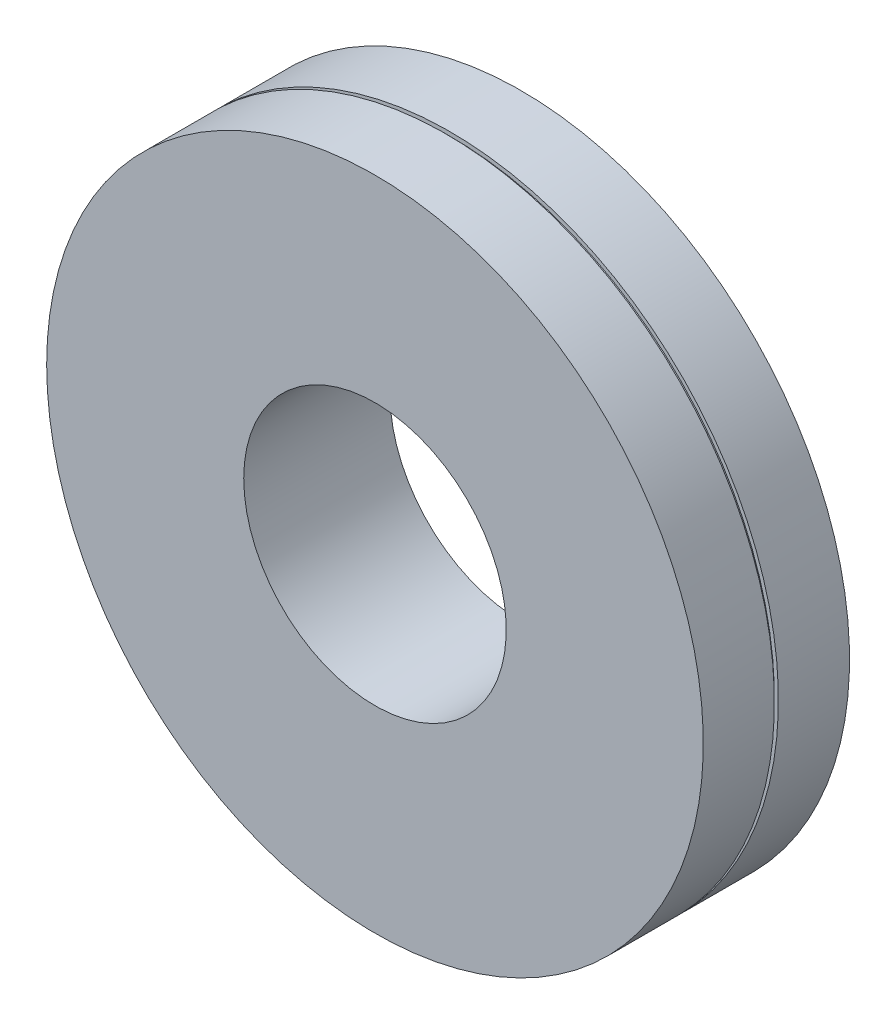
ISO-10303-21;
HEADER;
FILE_DESCRIPTION(('STEP AP214'),'2;1');
FILE_NAME('part.step','',(''),(''),'','','');
FILE_SCHEMA(('AUTOMOTIVE_DESIGN { 1 0 10303 214 1 1 1 1 }'));
ENDSEC;
DATA;
#1=APPLICATION_CONTEXT('core data for automotive mechanical design processes');
#2=APPLICATION_PROTOCOL_DEFINITION('international standard','automotive_design',2000,#1);
#3=PRODUCT_CONTEXT('',#1,'mechanical');
#4=PRODUCT('Part','Part','',(#3));
#5=PRODUCT_RELATED_PRODUCT_CATEGORY('part','',(#4));
#6=PRODUCT_DEFINITION_FORMATION('','',#4);
#7=PRODUCT_DEFINITION_CONTEXT('part definition',#1,'design');
#8=PRODUCT_DEFINITION('design','',#6,#7);
#9=PRODUCT_DEFINITION_SHAPE('','',#8);
#10=(LENGTH_UNIT() NAMED_UNIT(*) SI_UNIT(.MILLI.,.METRE.));
#11=(NAMED_UNIT(*) PLANE_ANGLE_UNIT() SI_UNIT($,.RADIAN.));
#12=(NAMED_UNIT(*) SI_UNIT($,.STERADIAN.) SOLID_ANGLE_UNIT());
#13=UNCERTAINTY_MEASURE_WITH_UNIT(LENGTH_MEASURE(1.E-05),#10,'distance_accuracy_value','');
#14=(GEOMETRIC_REPRESENTATION_CONTEXT(3) GLOBAL_UNCERTAINTY_ASSIGNED_CONTEXT((#13)) GLOBAL_UNIT_ASSIGNED_CONTEXT((#10,
#11,#12)) REPRESENTATION_CONTEXT('',''));
#15=CARTESIAN_POINT('',(0.,0.,0.));
#16=DIRECTION('',(0.,0.,1.));
#17=DIRECTION('',(1.,0.,0.));
#18=AXIS2_PLACEMENT_3D('',#15,#16,#17);
#19=CARTESIAN_POINT('',(-6.1976,0.,-1.4351));
#20=DIRECTION('',(0.,0.,1.));
#21=DIRECTION('',(1.,0.,0.));
#22=AXIS2_PLACEMENT_3D('',#19,#20,#21);
#23=PLANE('',#22);
#24=CARTESIAN_POINT('',(0.,0.,-1.4351));
#25=DIRECTION('',(0.,0.,-1.));
#26=DIRECTION('',(-1.,0.,0.));
#27=AXIS2_PLACEMENT_3D('',#24,#25,#26);
#28=CIRCLE('',#27,6.1976);
#29=CARTESIAN_POINT('',(-6.1976,0.,-1.4351));
#30=VERTEX_POINT('',#29);
#31=EDGE_CURVE('E17',#30,#30,#28,.F.);
#32=ORIENTED_EDGE('',*,*,#31,.F.);
#33=EDGE_LOOP('',(#32));
#34=FACE_BOUND('',#33,.T.);
#35=CARTESIAN_POINT('',(0.,0.,-1.4351));
#36=DIRECTION('',(0.,0.,-1.));
#37=DIRECTION('',(-1.,0.,0.));
#38=AXIS2_PLACEMENT_3D('',#35,#36,#37);
#39=CIRCLE('',#38,6.2738);
#40=CARTESIAN_POINT('',(-6.2738,0.,-1.4351));
#41=VERTEX_POINT('',#40);
#42=EDGE_CURVE('E39',#41,#41,#39,.T.);
#43=ORIENTED_EDGE('',*,*,#42,.F.);
#44=EDGE_LOOP('',(#43));
#45=FACE_BOUND('',#44,.T.);
#46=ADVANCED_FACE('F14',(#34,#45),#23,.T.);
#47=CARTESIAN_POINT('',(0.,0.,0.));
#48=DIRECTION('',(0.,0.,-1.));
#49=DIRECTION('',(-1.,0.,0.));
#50=AXIS2_PLACEMENT_3D('',#47,#48,#49);
#51=CYLINDRICAL_SURFACE('',#50,6.1976);
#52=CARTESIAN_POINT('',(0.,0.,-1.3589));
#53=DIRECTION('',(0.,0.,-1.));
#54=DIRECTION('',(-1.,0.,0.));
#55=AXIS2_PLACEMENT_3D('',#52,#53,#54);
#56=CIRCLE('',#55,6.1976);
#57=CARTESIAN_POINT('',(-6.1976,0.,-1.3589));
#58=VERTEX_POINT('',#57);
#59=EDGE_CURVE('E37',#58,#58,#56,.F.);
#60=ORIENTED_EDGE('',*,*,#59,.F.);
#61=EDGE_LOOP('',(#60));
#62=FACE_BOUND('',#61,.T.);
#63=ORIENTED_EDGE('',*,*,#31,.T.);
#64=EDGE_LOOP('',(#63));
#65=FACE_BOUND('',#64,.T.);
#66=ADVANCED_FACE('F46',(#62,#65),#51,.T.);
#67=CARTESIAN_POINT('',(0.,0.,-2.794));
#68=DIRECTION('',(0.,0.,-1.));
#69=DIRECTION('',(-1.,0.,0.));
#70=AXIS2_PLACEMENT_3D('',#67,#68,#69);
#71=CYLINDRICAL_SURFACE('',#70,6.2738);
#72=ORIENTED_EDGE('',*,*,#42,.T.);
#73=EDGE_LOOP('',(#72));
#74=FACE_BOUND('',#73,.T.);
#75=CARTESIAN_POINT('',(0.,0.,-2.794));
#76=DIRECTION('',(0.,0.,-1.));
#77=DIRECTION('',(-1.,0.,0.));
#78=AXIS2_PLACEMENT_3D('',#75,#76,#77);
#79=CIRCLE('',#78,6.2738);
#80=CARTESIAN_POINT('',(-6.2738,0.,-2.794));
#81=VERTEX_POINT('',#80);
#82=EDGE_CURVE('E34',#81,#81,#79,.T.);
#83=ORIENTED_EDGE('',*,*,#82,.F.);
#84=EDGE_LOOP('',(#83));
#85=FACE_BOUND('',#84,.T.);
#86=ADVANCED_FACE('F54',(#74,#85),#71,.T.);
#87=CARTESIAN_POINT('',(-6.2738,0.,-1.3589));
#88=DIRECTION('',(0.,0.,-1.));
#89=DIRECTION('',(-1.,0.,0.));
#90=AXIS2_PLACEMENT_3D('',#87,#88,#89);
#91=PLANE('',#90);
#92=CARTESIAN_POINT('',(0.,0.,-1.3589));
#93=DIRECTION('',(0.,0.,-1.));
#94=DIRECTION('',(-1.,0.,0.));
#95=AXIS2_PLACEMENT_3D('',#92,#93,#94);
#96=CIRCLE('',#95,6.2738);
#97=CARTESIAN_POINT('',(-6.2738,0.,-1.3589));
#98=VERTEX_POINT('',#97);
#99=EDGE_CURVE('E31',#98,#98,#96,.F.);
#100=ORIENTED_EDGE('',*,*,#99,.F.);
#101=EDGE_LOOP('',(#100));
#102=FACE_BOUND('',#101,.T.);
#103=ORIENTED_EDGE('',*,*,#59,.T.);
#104=EDGE_LOOP('',(#103));
#105=FACE_BOUND('',#104,.T.);
#106=ADVANCED_FACE('F75',(#102,#105),#91,.T.);
#107=CARTESIAN_POINT('',(0.,0.,-2.794));
#108=DIRECTION('',(0.,0.,-1.));
#109=DIRECTION('',(-1.,0.,0.));
#110=AXIS2_PLACEMENT_3D('',#107,#108,#109);
#111=PLANE('',#110);
#112=CARTESIAN_POINT('',(0.,0.,-2.794));
#113=DIRECTION('',(0.,0.,-1.));
#114=DIRECTION('',(-1.,0.,0.));
#115=AXIS2_PLACEMENT_3D('',#112,#113,#114);
#116=CIRCLE('',#115,2.50825);
#117=CARTESIAN_POINT('',(-2.50825,0.,-2.794));
#118=VERTEX_POINT('',#117);
#119=EDGE_CURVE('E26',#118,#118,#116,.F.);
#120=ORIENTED_EDGE('',*,*,#119,.T.);
#121=EDGE_LOOP('',(#120));
#122=FACE_BOUND('',#121,.T.);
#123=ORIENTED_EDGE('',*,*,#82,.T.);
#124=EDGE_LOOP('',(#123));
#125=FACE_BOUND('',#124,.T.);
#126=ADVANCED_FACE('F71',(#122,#125),#111,.T.);
#127=CARTESIAN_POINT('',(0.,0.,-2.794));
#128=DIRECTION('',(0.,0.,-1.));
#129=DIRECTION('',(-1.,0.,0.));
#130=AXIS2_PLACEMENT_3D('',#127,#128,#129);
#131=CYLINDRICAL_SURFACE('',#130,6.2738);
#132=ORIENTED_EDGE('',*,*,#99,.T.);
#133=EDGE_LOOP('',(#132));
#134=FACE_BOUND('',#133,.T.);
#135=CARTESIAN_POINT('',(0.,0.,0.));
#136=DIRECTION('',(0.,0.,-1.));
#137=DIRECTION('',(-1.,0.,0.));
#138=AXIS2_PLACEMENT_3D('',#135,#136,#137);
#139=CIRCLE('',#138,6.2738);
#140=CARTESIAN_POINT('',(-6.2738,0.,0.));
#141=VERTEX_POINT('',#140);
#142=EDGE_CURVE('E21',#141,#141,#139,.T.);
#143=ORIENTED_EDGE('',*,*,#142,.T.);
#144=EDGE_LOOP('',(#143));
#145=FACE_BOUND('',#144,.T.);
#146=ADVANCED_FACE('F64',(#134,#145),#131,.T.);
#147=CARTESIAN_POINT('',(0.,0.,-17.9636011846178));
#148=DIRECTION('',(0.,0.,-1.));
#149=DIRECTION('',(-1.,0.,0.));
#150=AXIS2_PLACEMENT_3D('',#147,#148,#149);
#151=CYLINDRICAL_SURFACE('',#150,2.50825);
#152=ORIENTED_EDGE('',*,*,#119,.F.);
#153=EDGE_LOOP('',(#152));
#154=FACE_BOUND('',#153,.T.);
#155=CARTESIAN_POINT('',(0.,0.,0.));
#156=DIRECTION('',(0.,0.,-1.));
#157=DIRECTION('',(-1.,0.,0.));
#158=AXIS2_PLACEMENT_3D('',#155,#156,#157);
#159=CIRCLE('',#158,2.50825);
#160=CARTESIAN_POINT('',(-2.50825,0.,0.));
#161=VERTEX_POINT('',#160);
#162=EDGE_CURVE('E10',#161,#161,#159,.F.);
#163=ORIENTED_EDGE('',*,*,#162,.T.);
#164=EDGE_LOOP('',(#163));
#165=FACE_BOUND('',#164,.T.);
#166=ADVANCED_FACE('F58',(#154,#165),#151,.F.);
#167=CARTESIAN_POINT('',(0.,0.,0.));
#168=DIRECTION('',(0.,0.,-1.));
#169=DIRECTION('',(-1.,0.,0.));
#170=AXIS2_PLACEMENT_3D('',#167,#168,#169);
#171=PLANE('',#170);
#172=ORIENTED_EDGE('',*,*,#162,.F.);
#173=EDGE_LOOP('',(#172));
#174=FACE_BOUND('',#173,.T.);
#175=ORIENTED_EDGE('',*,*,#142,.F.);
#176=EDGE_LOOP('',(#175));
#177=FACE_BOUND('',#176,.T.);
#178=ADVANCED_FACE('F56',(#174,#177),#171,.F.);
#179=CLOSED_SHELL('',(#46,#66,#86,#106,#126,#146,#166,#178));
#180=MANIFOLD_SOLID_BREP('B1',#179);
#181=ADVANCED_BREP_SHAPE_REPRESENTATION('',(#18,#180),#14);
#182=SHAPE_DEFINITION_REPRESENTATION(#9,#181);
ENDSEC;
END-ISO-10303-21;
